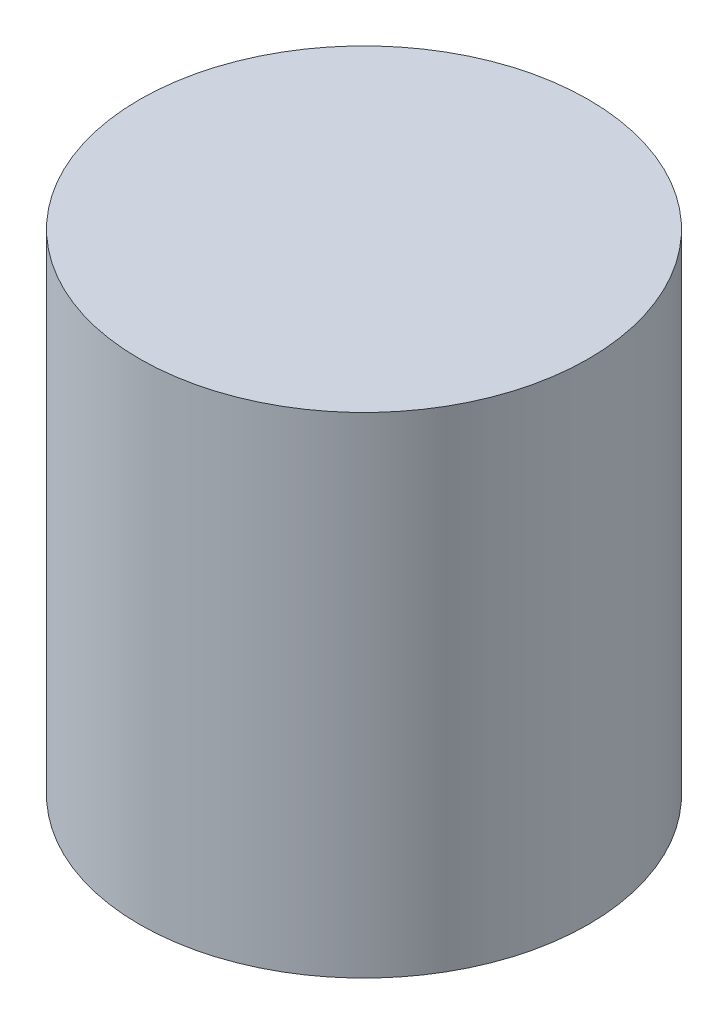
ISO-10303-21;
HEADER;
FILE_DESCRIPTION(('STEP AP214'),'2;1');
FILE_NAME('part.step','',(''),(''),'','','');
FILE_SCHEMA(('AUTOMOTIVE_DESIGN { 1 0 10303 214 1 1 1 1 }'));
ENDSEC;
DATA;
#1=APPLICATION_CONTEXT('core data for automotive mechanical design processes');
#2=APPLICATION_PROTOCOL_DEFINITION('international standard','automotive_design',2000,#1);
#3=PRODUCT_CONTEXT('',#1,'mechanical');
#4=PRODUCT('Part','Part','',(#3));
#5=PRODUCT_RELATED_PRODUCT_CATEGORY('part','',(#4));
#6=PRODUCT_DEFINITION_FORMATION('','',#4);
#7=PRODUCT_DEFINITION_CONTEXT('part definition',#1,'design');
#8=PRODUCT_DEFINITION('design','',#6,#7);
#9=PRODUCT_DEFINITION_SHAPE('','',#8);
#10=(LENGTH_UNIT() NAMED_UNIT(*) SI_UNIT(.MILLI.,.METRE.));
#11=(NAMED_UNIT(*) PLANE_ANGLE_UNIT() SI_UNIT($,.RADIAN.));
#12=(NAMED_UNIT(*) SI_UNIT($,.STERADIAN.) SOLID_ANGLE_UNIT());
#13=UNCERTAINTY_MEASURE_WITH_UNIT(LENGTH_MEASURE(1.E-05),#10,'distance_accuracy_value','');
#14=(GEOMETRIC_REPRESENTATION_CONTEXT(3) GLOBAL_UNCERTAINTY_ASSIGNED_CONTEXT((#13)) GLOBAL_UNIT_ASSIGNED_CONTEXT((#10,
#11,#12)) REPRESENTATION_CONTEXT('',''));
#15=CARTESIAN_POINT('',(0.,0.,0.));
#16=DIRECTION('',(0.,0.,1.));
#17=DIRECTION('',(1.,0.,0.));
#18=AXIS2_PLACEMENT_3D('',#15,#16,#17);
#19=CARTESIAN_POINT('',(0.,12.,0.));
#20=DIRECTION('',(0.,-1.,0.));
#21=DIRECTION('',(0.,0.,-1.));
#22=AXIS2_PLACEMENT_3D('',#19,#20,#21);
#23=CYLINDRICAL_SURFACE('',#22,5.5);
#24=CARTESIAN_POINT('',(0.,12.,0.));
#25=DIRECTION('',(0.,1.,0.));
#26=DIRECTION('',(0.,0.,1.));
#27=AXIS2_PLACEMENT_3D('',#24,#25,#26);
#28=CIRCLE('',#27,5.5);
#29=CARTESIAN_POINT('',(0.,12.,5.5));
#30=VERTEX_POINT('',#29);
#31=EDGE_CURVE('E10',#30,#30,#28,.T.);
#32=ORIENTED_EDGE('',*,*,#31,.F.);
#33=EDGE_LOOP('',(#32));
#34=FACE_BOUND('',#33,.T.);
#35=CARTESIAN_POINT('',(0.,0.,0.));
#36=DIRECTION('',(0.,1.,0.));
#37=DIRECTION('',(0.,0.,1.));
#38=AXIS2_PLACEMENT_3D('',#35,#36,#37);
#39=CIRCLE('',#38,5.5);
#40=CARTESIAN_POINT('',(0.,0.,5.5));
#41=VERTEX_POINT('',#40);
#42=EDGE_CURVE('E44',#41,#41,#39,.T.);
#43=ORIENTED_EDGE('',*,*,#42,.T.);
#44=EDGE_LOOP('',(#43));
#45=FACE_BOUND('',#44,.T.);
#46=ADVANCED_FACE('F41',(#34,#45),#23,.T.);
#47=CARTESIAN_POINT('',(0.,12.,0.));
#48=DIRECTION('',(0.,1.,0.));
#49=DIRECTION('',(0.,0.,1.));
#50=AXIS2_PLACEMENT_3D('',#47,#48,#49);
#51=PLANE('',#50);
#52=ORIENTED_EDGE('',*,*,#31,.T.);
#53=EDGE_LOOP('',(#52));
#54=FACE_BOUND('',#53,.T.);
#55=ADVANCED_FACE('F70',(#54),#51,.T.);
#56=CARTESIAN_POINT('',(0.,0.,0.));
#57=DIRECTION('',(0.,1.,0.));
#58=DIRECTION('',(0.,0.,1.));
#59=AXIS2_PLACEMENT_3D('',#56,#57,#58);
#60=PLANE('',#59);
#61=CARTESIAN_POINT('',(0.,0.,0.));
#62=DIRECTION('',(0.,-1.,0.));
#63=DIRECTION('',(0.,0.,-1.));
#64=AXIS2_PLACEMENT_3D('',#61,#62,#63);
#65=CIRCLE('',#64,3.);
#66=CARTESIAN_POINT('',(0.,0.,-3.));
#67=VERTEX_POINT('',#66);
#68=EDGE_CURVE('E53',#67,#67,#65,.T.);
#69=ORIENTED_EDGE('',*,*,#68,.F.);
#70=EDGE_LOOP('',(#69));
#71=FACE_BOUND('',#70,.T.);
#72=ORIENTED_EDGE('',*,*,#42,.F.);
#73=EDGE_LOOP('',(#72));
#74=FACE_BOUND('',#73,.T.);
#75=ADVANCED_FACE('F64',(#71,#74),#60,.F.);
#76=CARTESIAN_POINT('',(0.,5.,0.));
#77=DIRECTION('',(0.,-1.,0.));
#78=DIRECTION('',(0.,0.,-1.));
#79=AXIS2_PLACEMENT_3D('',#76,#77,#78);
#80=CYLINDRICAL_SURFACE('',#79,3.);
#81=CARTESIAN_POINT('',(0.,5.,0.));
#82=DIRECTION('',(0.,-1.,0.));
#83=DIRECTION('',(0.,0.,-1.));
#84=AXIS2_PLACEMENT_3D('',#81,#82,#83);
#85=CIRCLE('',#84,3.);
#86=CARTESIAN_POINT('',(0.,5.,-3.));
#87=VERTEX_POINT('',#86);
#88=EDGE_CURVE('E51',#87,#87,#85,.T.);
#89=ORIENTED_EDGE('',*,*,#88,.F.);
#90=EDGE_LOOP('',(#89));
#91=FACE_BOUND('',#90,.T.);
#92=ORIENTED_EDGE('',*,*,#68,.T.);
#93=EDGE_LOOP('',(#92));
#94=FACE_BOUND('',#93,.T.);
#95=ADVANCED_FACE('F61',(#91,#94),#80,.F.);
#96=CARTESIAN_POINT('',(0.,5.,0.));
#97=DIRECTION('',(0.,-1.,0.));
#98=DIRECTION('',(0.,0.,-1.));
#99=AXIS2_PLACEMENT_3D('',#96,#97,#98);
#100=PLANE('',#99);
#101=ORIENTED_EDGE('',*,*,#88,.T.);
#102=EDGE_LOOP('',(#101));
#103=FACE_BOUND('',#102,.T.);
#104=ADVANCED_FACE('F59',(#103),#100,.T.);
#105=CLOSED_SHELL('',(#46,#55,#75,#95,#104));
#106=MANIFOLD_SOLID_BREP('B2',#105);
#107=ADVANCED_BREP_SHAPE_REPRESENTATION('',(#18,#106),#14);
#108=SHAPE_DEFINITION_REPRESENTATION(#9,#107);
ENDSEC;
END-ISO-10303-21;
